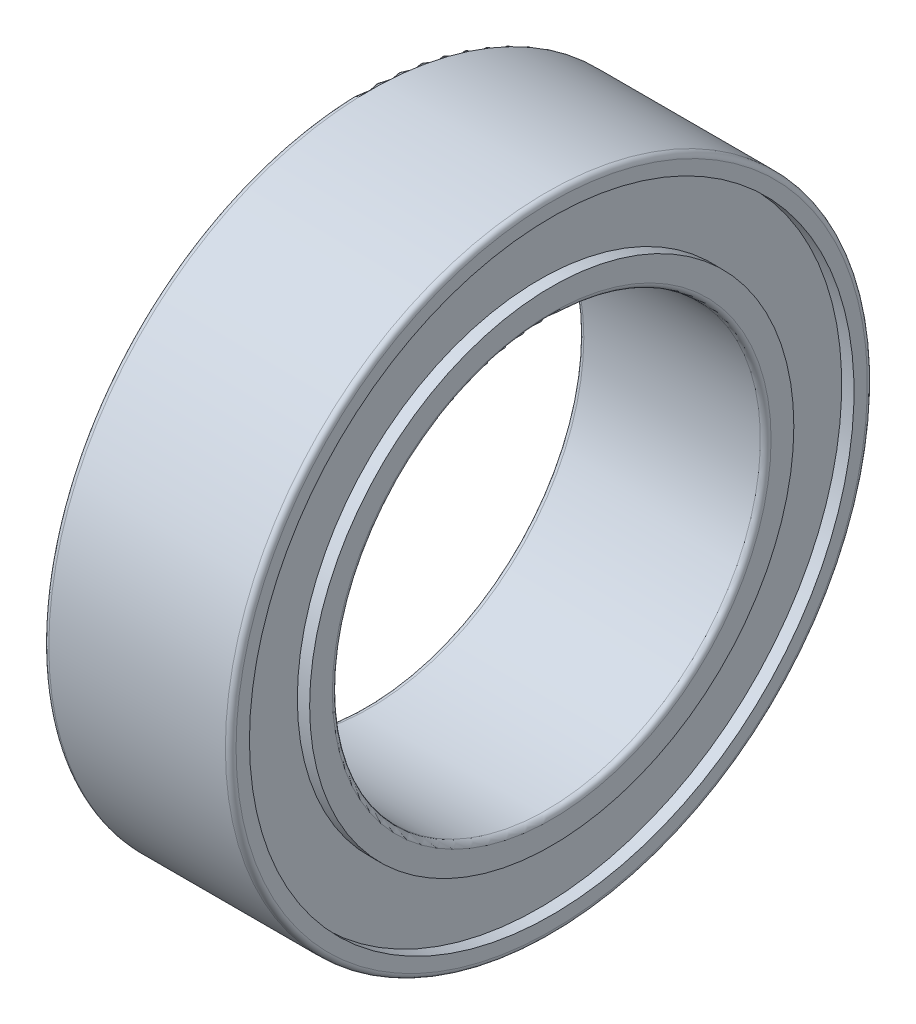
ISO-10303-21;
HEADER;
FILE_DESCRIPTION(('STEP AP214'),'2;1');
FILE_NAME('part.step','',(''),(''),'','','');
FILE_SCHEMA(('AUTOMOTIVE_DESIGN { 1 0 10303 214 1 1 1 1 }'));
ENDSEC;
DATA;
#1=APPLICATION_CONTEXT('core data for automotive mechanical design processes');
#2=APPLICATION_PROTOCOL_DEFINITION('international standard','automotive_design',2000,#1);
#3=PRODUCT_CONTEXT('',#1,'mechanical');
#4=PRODUCT('Part','Part','',(#3));
#5=PRODUCT_RELATED_PRODUCT_CATEGORY('part','',(#4));
#6=PRODUCT_DEFINITION_FORMATION('','',#4);
#7=PRODUCT_DEFINITION_CONTEXT('part definition',#1,'design');
#8=PRODUCT_DEFINITION('design','',#6,#7);
#9=PRODUCT_DEFINITION_SHAPE('','',#8);
#10=(LENGTH_UNIT() NAMED_UNIT(*) SI_UNIT(.MILLI.,.METRE.));
#11=(NAMED_UNIT(*) PLANE_ANGLE_UNIT() SI_UNIT($,.RADIAN.));
#12=(NAMED_UNIT(*) SI_UNIT($,.STERADIAN.) SOLID_ANGLE_UNIT());
#13=UNCERTAINTY_MEASURE_WITH_UNIT(LENGTH_MEASURE(1.E-05),#10,'distance_accuracy_value','');
#14=(GEOMETRIC_REPRESENTATION_CONTEXT(3) GLOBAL_UNCERTAINTY_ASSIGNED_CONTEXT((#13)) GLOBAL_UNIT_ASSIGNED_CONTEXT((#10,
#11,#12)) REPRESENTATION_CONTEXT('',''));
#15=CARTESIAN_POINT('',(0.,0.,0.));
#16=DIRECTION('',(0.,0.,1.));
#17=DIRECTION('',(1.,0.,0.));
#18=AXIS2_PLACEMENT_3D('',#15,#16,#17);
#19=CARTESIAN_POINT('',(0.,6.,0.));
#20=DIRECTION('',(1.,0.,0.));
#21=DIRECTION('',(0.,0.,-1.));
#22=AXIS2_PLACEMENT_3D('',#19,#20,#21);
#23=PLANE('',#22);
#24=CARTESIAN_POINT('',(0.,0.,0.));
#25=DIRECTION('',(1.,0.,0.));
#26=DIRECTION('',(0.,0.,-1.));
#27=AXIS2_PLACEMENT_3D('',#24,#25,#26);
#28=CIRCLE('',#27,5.9);
#29=CARTESIAN_POINT('',(0.,0.,-5.9));
#30=VERTEX_POINT('',#29);
#31=EDGE_CURVE('E51',#30,#30,#28,.F.);
#32=ORIENTED_EDGE('',*,*,#31,.T.);
#33=EDGE_LOOP('',(#32));
#34=FACE_BOUND('',#33,.T.);
#35=CARTESIAN_POINT('',(0.,0.,0.));
#36=DIRECTION('',(-1.,0.,0.));
#37=DIRECTION('',(0.,0.,1.));
#38=AXIS2_PLACEMENT_3D('',#35,#36,#37);
#39=CIRCLE('',#38,5.65);
#40=CARTESIAN_POINT('',(0.,0.,5.65));
#41=VERTEX_POINT('',#40);
#42=EDGE_CURVE('E63',#41,#41,#39,.T.);
#43=ORIENTED_EDGE('',*,*,#42,.F.);
#44=EDGE_LOOP('',(#43));
#45=FACE_BOUND('',#44,.T.);
#46=ADVANCED_FACE('F31',(#34,#45),#23,.F.);
#47=CARTESIAN_POINT('',(0.,0.,0.));
#48=DIRECTION('',(-1.,0.,0.));
#49=DIRECTION('',(0.,0.,1.));
#50=AXIS2_PLACEMENT_3D('',#47,#48,#49);
#51=CYLINDRICAL_SURFACE('',#50,5.65);
#52=CARTESIAN_POINT('',(0.23,0.,0.));
#53=DIRECTION('',(-1.,0.,0.));
#54=DIRECTION('',(0.,0.,1.));
#55=AXIS2_PLACEMENT_3D('',#52,#53,#54);
#56=CIRCLE('',#55,5.65);
#57=CARTESIAN_POINT('',(0.23,0.,5.65));
#58=VERTEX_POINT('',#57);
#59=EDGE_CURVE('E66',#58,#58,#56,.T.);
#60=ORIENTED_EDGE('',*,*,#59,.F.);
#61=EDGE_LOOP('',(#60));
#62=FACE_BOUND('',#61,.T.);
#63=ORIENTED_EDGE('',*,*,#42,.T.);
#64=EDGE_LOOP('',(#63));
#65=FACE_BOUND('',#64,.T.);
#66=ADVANCED_FACE('F119',(#62,#65),#51,.F.);
#67=CARTESIAN_POINT('',(0.23,5.65,0.));
#68=DIRECTION('',(1.,0.,0.));
#69=DIRECTION('',(0.,0.,-1.));
#70=AXIS2_PLACEMENT_3D('',#67,#68,#69);
#71=PLANE('',#70);
#72=CARTESIAN_POINT('',(0.23,0.,0.));
#73=DIRECTION('',(-1.,0.,0.));
#74=DIRECTION('',(0.,0.,1.));
#75=AXIS2_PLACEMENT_3D('',#72,#73,#74);
#76=CIRCLE('',#75,4.525);
#77=CARTESIAN_POINT('',(0.23,0.,4.525));
#78=VERTEX_POINT('',#77);
#79=EDGE_CURVE('E69',#78,#78,#76,.T.);
#80=ORIENTED_EDGE('',*,*,#79,.F.);
#81=EDGE_LOOP('',(#80));
#82=FACE_BOUND('',#81,.T.);
#83=ORIENTED_EDGE('',*,*,#59,.T.);
#84=EDGE_LOOP('',(#83));
#85=FACE_BOUND('',#84,.T.);
#86=ADVANCED_FACE('F125',(#82,#85),#71,.F.);
#87=CARTESIAN_POINT('',(0.,0.,0.));
#88=DIRECTION('',(-1.,0.,0.));
#89=DIRECTION('',(0.,0.,1.));
#90=AXIS2_PLACEMENT_3D('',#87,#88,#89);
#91=CYLINDRICAL_SURFACE('',#90,4.525);
#92=CARTESIAN_POINT('',(0.,0.,0.));
#93=DIRECTION('',(-1.,0.,0.));
#94=DIRECTION('',(0.,0.,1.));
#95=AXIS2_PLACEMENT_3D('',#92,#93,#94);
#96=CIRCLE('',#95,4.525);
#97=CARTESIAN_POINT('',(0.,0.,4.525));
#98=VERTEX_POINT('',#97);
#99=EDGE_CURVE('E72',#98,#98,#96,.T.);
#100=ORIENTED_EDGE('',*,*,#99,.F.);
#101=EDGE_LOOP('',(#100));
#102=FACE_BOUND('',#101,.T.);
#103=ORIENTED_EDGE('',*,*,#79,.T.);
#104=EDGE_LOOP('',(#103));
#105=FACE_BOUND('',#104,.T.);
#106=ADVANCED_FACE('F178',(#102,#105),#91,.T.);
#107=CARTESIAN_POINT('',(0.,4.525,0.));
#108=DIRECTION('',(1.,0.,0.));
#109=DIRECTION('',(0.,0.,-1.));
#110=AXIS2_PLACEMENT_3D('',#107,#108,#109);
#111=PLANE('',#110);
#112=CARTESIAN_POINT('',(0.,0.,0.));
#113=DIRECTION('',(1.,0.,0.));
#114=DIRECTION('',(0.,0.,-1.));
#115=AXIS2_PLACEMENT_3D('',#112,#113,#114);
#116=CIRCLE('',#115,4.1);
#117=CARTESIAN_POINT('',(0.,0.,-4.1));
#118=VERTEX_POINT('',#117);
#119=EDGE_CURVE('E10',#118,#118,#116,.T.);
#120=ORIENTED_EDGE('',*,*,#119,.T.);
#121=EDGE_LOOP('',(#120));
#122=FACE_BOUND('',#121,.T.);
#123=ORIENTED_EDGE('',*,*,#99,.T.);
#124=EDGE_LOOP('',(#123));
#125=FACE_BOUND('',#124,.T.);
#126=ADVANCED_FACE('F116',(#122,#125),#111,.F.);
#127=CARTESIAN_POINT('',(0.,0.,0.));
#128=DIRECTION('',(-1.,0.,0.));
#129=DIRECTION('',(0.,0.,1.));
#130=AXIS2_PLACEMENT_3D('',#127,#128,#129);
#131=CYLINDRICAL_SURFACE('',#130,4.);
#132=CARTESIAN_POINT('',(3.4,0.,0.));
#133=DIRECTION('',(-1.,0.,0.));
#134=DIRECTION('',(0.,0.,1.));
#135=AXIS2_PLACEMENT_3D('',#132,#133,#134);
#136=CIRCLE('',#135,4.);
#137=CARTESIAN_POINT('',(3.4,0.,4.));
#138=VERTEX_POINT('',#137);
#139=EDGE_CURVE('E38',#138,#138,#136,.F.);
#140=ORIENTED_EDGE('',*,*,#139,.T.);
#141=EDGE_LOOP('',(#140));
#142=FACE_BOUND('',#141,.T.);
#143=CARTESIAN_POINT('',(0.0999999999999998,0.,0.));
#144=DIRECTION('',(1.,0.,0.));
#145=DIRECTION('',(0.,0.,-1.));
#146=AXIS2_PLACEMENT_3D('',#143,#144,#145);
#147=CIRCLE('',#146,4.);
#148=CARTESIAN_POINT('',(0.0999999999999998,0.,-4.));
#149=VERTEX_POINT('',#148);
#150=EDGE_CURVE('E42',#149,#149,#147,.F.);
#151=ORIENTED_EDGE('',*,*,#150,.T.);
#152=EDGE_LOOP('',(#151));
#153=FACE_BOUND('',#152,.T.);
#154=ADVANCED_FACE('F110',(#142,#153),#131,.F.);
#155=CARTESIAN_POINT('',(3.5,4.525,0.));
#156=DIRECTION('',(-1.,0.,0.));
#157=DIRECTION('',(0.,0.,1.));
#158=AXIS2_PLACEMENT_3D('',#155,#156,#157);
#159=PLANE('',#158);
#160=CARTESIAN_POINT('',(3.5,0.,0.));
#161=DIRECTION('',(-1.,0.,0.));
#162=DIRECTION('',(0.,0.,1.));
#163=AXIS2_PLACEMENT_3D('',#160,#161,#162);
#164=CIRCLE('',#163,4.1);
#165=CARTESIAN_POINT('',(3.5,0.,4.1));
#166=VERTEX_POINT('',#165);
#167=EDGE_CURVE('E46',#166,#166,#164,.T.);
#168=ORIENTED_EDGE('',*,*,#167,.T.);
#169=EDGE_LOOP('',(#168));
#170=FACE_BOUND('',#169,.T.);
#171=CARTESIAN_POINT('',(3.5,0.,0.));
#172=DIRECTION('',(-1.,0.,0.));
#173=DIRECTION('',(0.,0.,1.));
#174=AXIS2_PLACEMENT_3D('',#171,#172,#173);
#175=CIRCLE('',#174,4.525);
#176=CARTESIAN_POINT('',(3.5,0.,4.525));
#177=VERTEX_POINT('',#176);
#178=EDGE_CURVE('E75',#177,#177,#175,.T.);
#179=ORIENTED_EDGE('',*,*,#178,.F.);
#180=EDGE_LOOP('',(#179));
#181=FACE_BOUND('',#180,.T.);
#182=ADVANCED_FACE('F105',(#170,#181),#159,.F.);
#183=CARTESIAN_POINT('',(0.,0.,0.));
#184=DIRECTION('',(-1.,0.,0.));
#185=DIRECTION('',(0.,0.,1.));
#186=AXIS2_PLACEMENT_3D('',#183,#184,#185);
#187=CYLINDRICAL_SURFACE('',#186,4.525);
#188=CARTESIAN_POINT('',(3.27,0.,0.));
#189=DIRECTION('',(-1.,0.,0.));
#190=DIRECTION('',(0.,0.,1.));
#191=AXIS2_PLACEMENT_3D('',#188,#189,#190);
#192=CIRCLE('',#191,4.525);
#193=CARTESIAN_POINT('',(3.27,0.,4.525));
#194=VERTEX_POINT('',#193);
#195=EDGE_CURVE('E78',#194,#194,#192,.T.);
#196=ORIENTED_EDGE('',*,*,#195,.F.);
#197=EDGE_LOOP('',(#196));
#198=FACE_BOUND('',#197,.T.);
#199=ORIENTED_EDGE('',*,*,#178,.T.);
#200=EDGE_LOOP('',(#199));
#201=FACE_BOUND('',#200,.T.);
#202=ADVANCED_FACE('F99',(#198,#201),#187,.T.);
#203=CARTESIAN_POINT('',(3.27,5.65,0.));
#204=DIRECTION('',(-1.,0.,0.));
#205=DIRECTION('',(0.,0.,1.));
#206=AXIS2_PLACEMENT_3D('',#203,#204,#205);
#207=PLANE('',#206);
#208=CARTESIAN_POINT('',(3.27,0.,0.));
#209=DIRECTION('',(-1.,0.,0.));
#210=DIRECTION('',(0.,0.,1.));
#211=AXIS2_PLACEMENT_3D('',#208,#209,#210);
#212=CIRCLE('',#211,5.65);
#213=CARTESIAN_POINT('',(3.27,0.,5.65));
#214=VERTEX_POINT('',#213);
#215=EDGE_CURVE('E81',#214,#214,#212,.T.);
#216=ORIENTED_EDGE('',*,*,#215,.F.);
#217=EDGE_LOOP('',(#216));
#218=FACE_BOUND('',#217,.T.);
#219=ORIENTED_EDGE('',*,*,#195,.T.);
#220=EDGE_LOOP('',(#219));
#221=FACE_BOUND('',#220,.T.);
#222=ADVANCED_FACE('F93',(#218,#221),#207,.F.);
#223=CARTESIAN_POINT('',(0.,0.,0.));
#224=DIRECTION('',(-1.,0.,0.));
#225=DIRECTION('',(0.,0.,1.));
#226=AXIS2_PLACEMENT_3D('',#223,#224,#225);
#227=CYLINDRICAL_SURFACE('',#226,5.65);
#228=CARTESIAN_POINT('',(3.5,0.,0.));
#229=DIRECTION('',(-1.,0.,0.));
#230=DIRECTION('',(0.,0.,1.));
#231=AXIS2_PLACEMENT_3D('',#228,#229,#230);
#232=CIRCLE('',#231,5.65);
#233=CARTESIAN_POINT('',(3.5,0.,5.65));
#234=VERTEX_POINT('',#233);
#235=EDGE_CURVE('E84',#234,#234,#232,.T.);
#236=ORIENTED_EDGE('',*,*,#235,.F.);
#237=EDGE_LOOP('',(#236));
#238=FACE_BOUND('',#237,.T.);
#239=ORIENTED_EDGE('',*,*,#215,.T.);
#240=EDGE_LOOP('',(#239));
#241=FACE_BOUND('',#240,.T.);
#242=ADVANCED_FACE('F90',(#238,#241),#227,.F.);
#243=CARTESIAN_POINT('',(3.5,6.,0.));
#244=DIRECTION('',(-1.,0.,0.));
#245=DIRECTION('',(0.,0.,1.));
#246=AXIS2_PLACEMENT_3D('',#243,#244,#245);
#247=PLANE('',#246);
#248=CARTESIAN_POINT('',(3.5,0.,0.));
#249=DIRECTION('',(-1.,0.,0.));
#250=DIRECTION('',(0.,0.,1.));
#251=AXIS2_PLACEMENT_3D('',#248,#249,#250);
#252=CIRCLE('',#251,5.9);
#253=CARTESIAN_POINT('',(3.5,0.,5.9));
#254=VERTEX_POINT('',#253);
#255=EDGE_CURVE('E54',#254,#254,#252,.F.);
#256=ORIENTED_EDGE('',*,*,#255,.T.);
#257=EDGE_LOOP('',(#256));
#258=FACE_BOUND('',#257,.T.);
#259=ORIENTED_EDGE('',*,*,#235,.T.);
#260=EDGE_LOOP('',(#259));
#261=FACE_BOUND('',#260,.T.);
#262=ADVANCED_FACE('F88',(#258,#261),#247,.F.);
#263=CARTESIAN_POINT('',(0.,0.,0.));
#264=DIRECTION('',(-1.,0.,0.));
#265=DIRECTION('',(0.,0.,1.));
#266=AXIS2_PLACEMENT_3D('',#263,#264,#265);
#267=CYLINDRICAL_SURFACE('',#266,6.);
#268=CARTESIAN_POINT('',(3.4,0.,0.));
#269=DIRECTION('',(-1.,0.,0.));
#270=DIRECTION('',(0.,0.,1.));
#271=AXIS2_PLACEMENT_3D('',#268,#269,#270);
#272=CIRCLE('',#271,6.);
#273=CARTESIAN_POINT('',(3.4,0.,6.));
#274=VERTEX_POINT('',#273);
#275=EDGE_CURVE('E57',#274,#274,#272,.T.);
#276=ORIENTED_EDGE('',*,*,#275,.T.);
#277=EDGE_LOOP('',(#276));
#278=FACE_BOUND('',#277,.T.);
#279=CARTESIAN_POINT('',(0.0999999999999996,0.,0.));
#280=DIRECTION('',(1.,0.,0.));
#281=DIRECTION('',(0.,0.,-1.));
#282=AXIS2_PLACEMENT_3D('',#279,#280,#281);
#283=CIRCLE('',#282,6.);
#284=CARTESIAN_POINT('',(0.0999999999999996,0.,-6.));
#285=VERTEX_POINT('',#284);
#286=EDGE_CURVE('E60',#285,#285,#283,.T.);
#287=ORIENTED_EDGE('',*,*,#286,.T.);
#288=EDGE_LOOP('',(#287));
#289=FACE_BOUND('',#288,.T.);
#290=ADVANCED_FACE('F135',(#278,#289),#267,.T.);
#291=CARTESIAN_POINT('',(3.4,0.,0.));
#292=DIRECTION('',(-1.,0.,0.));
#293=DIRECTION('',(0.,0.,1.));
#294=AXIS2_PLACEMENT_3D('',#291,#292,#293);
#295=TOROIDAL_SURFACE('',#294,5.9,0.1);
#296=ORIENTED_EDGE('',*,*,#255,.F.);
#297=EDGE_LOOP('',(#296));
#298=FACE_BOUND('',#297,.T.);
#299=ORIENTED_EDGE('',*,*,#275,.F.);
#300=EDGE_LOOP('',(#299));
#301=FACE_BOUND('',#300,.T.);
#302=ADVANCED_FACE('F131',(#298,#301),#295,.T.);
#303=CARTESIAN_POINT('',(0.0999999999999996,0.,0.));
#304=DIRECTION('',(1.,0.,0.));
#305=DIRECTION('',(0.,0.,-1.));
#306=AXIS2_PLACEMENT_3D('',#303,#304,#305);
#307=TOROIDAL_SURFACE('',#306,5.9,0.1);
#308=ORIENTED_EDGE('',*,*,#286,.F.);
#309=EDGE_LOOP('',(#308));
#310=FACE_BOUND('',#309,.T.);
#311=ORIENTED_EDGE('',*,*,#31,.F.);
#312=EDGE_LOOP('',(#311));
#313=FACE_BOUND('',#312,.T.);
#314=ADVANCED_FACE('F134',(#310,#313),#307,.T.);
#315=CARTESIAN_POINT('',(3.4,0.,0.));
#316=DIRECTION('',(-1.,0.,0.));
#317=DIRECTION('',(0.,0.,1.));
#318=AXIS2_PLACEMENT_3D('',#315,#316,#317);
#319=TOROIDAL_SURFACE('',#318,4.1,0.1);
#320=ORIENTED_EDGE('',*,*,#139,.F.);
#321=EDGE_LOOP('',(#320));
#322=FACE_BOUND('',#321,.T.);
#323=ORIENTED_EDGE('',*,*,#167,.F.);
#324=EDGE_LOOP('',(#323));
#325=FACE_BOUND('',#324,.T.);
#326=ADVANCED_FACE('F138',(#322,#325),#319,.T.);
#327=CARTESIAN_POINT('',(0.0999999999999998,0.,0.));
#328=DIRECTION('',(1.,0.,0.));
#329=DIRECTION('',(0.,0.,-1.));
#330=AXIS2_PLACEMENT_3D('',#327,#328,#329);
#331=TOROIDAL_SURFACE('',#330,4.1,0.1);
#332=ORIENTED_EDGE('',*,*,#119,.F.);
#333=EDGE_LOOP('',(#332));
#334=FACE_BOUND('',#333,.T.);
#335=ORIENTED_EDGE('',*,*,#150,.F.);
#336=EDGE_LOOP('',(#335));
#337=FACE_BOUND('',#336,.T.);
#338=ADVANCED_FACE('F33',(#334,#337),#331,.T.);
#339=CLOSED_SHELL('',(#46,#66,#86,#106,#126,#154,#182,#202,#222,#242,#262,#290,#302,#314,#326,#338));
#340=MANIFOLD_SOLID_BREP('B2',#339);
#341=ADVANCED_BREP_SHAPE_REPRESENTATION('',(#18,#340),#14);
#342=SHAPE_DEFINITION_REPRESENTATION(#9,#341);
ENDSEC;
END-ISO-10303-21;
